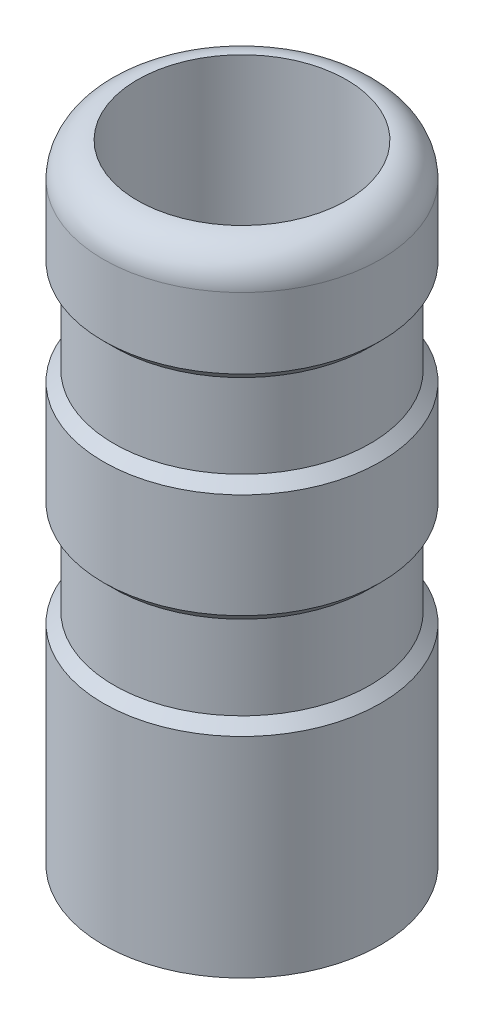
ISO-10303-21;
HEADER;
FILE_DESCRIPTION(('STEP AP214'),'2;1');
FILE_NAME('part.step','',(''),(''),'','','');
FILE_SCHEMA(('AUTOMOTIVE_DESIGN { 1 0 10303 214 1 1 1 1 }'));
ENDSEC;
DATA;
#1=APPLICATION_CONTEXT('core data for automotive mechanical design processes');
#2=APPLICATION_PROTOCOL_DEFINITION('international standard','automotive_design',2000,#1);
#3=PRODUCT_CONTEXT('',#1,'mechanical');
#4=PRODUCT('Part','Part','',(#3));
#5=PRODUCT_RELATED_PRODUCT_CATEGORY('part','',(#4));
#6=PRODUCT_DEFINITION_FORMATION('','',#4);
#7=PRODUCT_DEFINITION_CONTEXT('part definition',#1,'design');
#8=PRODUCT_DEFINITION('design','',#6,#7);
#9=PRODUCT_DEFINITION_SHAPE('','',#8);
#10=(LENGTH_UNIT() NAMED_UNIT(*) SI_UNIT(.MILLI.,.METRE.));
#11=(NAMED_UNIT(*) PLANE_ANGLE_UNIT() SI_UNIT($,.RADIAN.));
#12=(NAMED_UNIT(*) SI_UNIT($,.STERADIAN.) SOLID_ANGLE_UNIT());
#13=UNCERTAINTY_MEASURE_WITH_UNIT(LENGTH_MEASURE(1.E-05),#10,'distance_accuracy_value','');
#14=(GEOMETRIC_REPRESENTATION_CONTEXT(3) GLOBAL_UNCERTAINTY_ASSIGNED_CONTEXT((#13)) GLOBAL_UNIT_ASSIGNED_CONTEXT((#10,
#11,#12)) REPRESENTATION_CONTEXT('',''));
#15=CARTESIAN_POINT('',(0.,0.,0.));
#16=DIRECTION('',(0.,0.,1.));
#17=DIRECTION('',(1.,0.,0.));
#18=AXIS2_PLACEMENT_3D('',#15,#16,#17);
#19=CARTESIAN_POINT('',(0.,76.2,0.));
#20=DIRECTION('',(0.,-1.,0.));
#21=DIRECTION('',(0.,0.,-1.));
#22=AXIS2_PLACEMENT_3D('',#19,#20,#21);
#23=CYLINDRICAL_SURFACE('',#22,16.8275);
#24=CARTESIAN_POINT('',(0.,38.1,0.));
#25=DIRECTION('',(0.,-1.,0.));
#26=DIRECTION('',(0.,0.,-1.));
#27=AXIS2_PLACEMENT_3D('',#24,#25,#26);
#28=CIRCLE('',#27,16.8275);
#29=CARTESIAN_POINT('',(0.,38.1,-16.8275));
#30=VERTEX_POINT('',#29);
#31=EDGE_CURVE('E77',#30,#30,#28,.T.);
#32=CARTESIAN_POINT('',(0.,50.8,0.));
#33=DIRECTION('',(0.,-1.,0.));
#34=DIRECTION('',(0.,0.,-1.));
#35=AXIS2_PLACEMENT_3D('',#32,#33,#34);
#36=CIRCLE('',#35,16.8275);
#37=CARTESIAN_POINT('',(0.,50.8,-16.8275));
#38=VERTEX_POINT('',#37);
#39=EDGE_CURVE('E73',#38,#38,#36,.T.);
#40=CARTESIAN_POINT('',(0.,38.1,-16.8275));
#41=CARTESIAN_POINT('',(0.,38.2322916666667,-16.8275));
#42=CARTESIAN_POINT('',(0.,38.3645833333333,-16.8275));
#43=CARTESIAN_POINT('',(0.,38.6291666666667,-16.8275));
#44=CARTESIAN_POINT('',(0.,38.7614583333333,-16.8275));
#45=CARTESIAN_POINT('',(0.,39.0260416666667,-16.8275));
#46=CARTESIAN_POINT('',(0.,39.1583333333334,-16.8275));
#47=CARTESIAN_POINT('',(0.,39.4229166666667,-16.8275));
#48=CARTESIAN_POINT('',(0.,39.5552083333333,-16.8275));
#49=CARTESIAN_POINT('',(0.,39.8197916666667,-16.8275));
#50=CARTESIAN_POINT('',(0.,39.9520833333333,-16.8275));
#51=CARTESIAN_POINT('',(0.,40.2166666666667,-16.8275));
#52=CARTESIAN_POINT('',(0.,40.3489583333333,-16.8275));
#53=CARTESIAN_POINT('',(0.,40.6135416666667,-16.8275));
#54=CARTESIAN_POINT('',(0.,40.7458333333334,-16.8275));
#55=CARTESIAN_POINT('',(0.,41.0104166666667,-16.8275));
#56=CARTESIAN_POINT('',(0.,41.1427083333333,-16.8275));
#57=CARTESIAN_POINT('',(0.,41.4072916666667,-16.8275));
#58=CARTESIAN_POINT('',(0.,41.5395833333333,-16.8275));
#59=CARTESIAN_POINT('',(0.,41.8041666666667,-16.8275));
#60=CARTESIAN_POINT('',(0.,41.9364583333333,-16.8275));
#61=CARTESIAN_POINT('',(0.,42.2010416666667,-16.8275));
#62=CARTESIAN_POINT('',(0.,42.3333333333333,-16.8275));
#63=CARTESIAN_POINT('',(0.,42.5979166666667,-16.8275));
#64=CARTESIAN_POINT('',(0.,42.7302083333333,-16.8275));
#65=CARTESIAN_POINT('',(0.,42.9947916666667,-16.8275));
#66=CARTESIAN_POINT('',(0.,43.1270833333333,-16.8275));
#67=CARTESIAN_POINT('',(0.,43.3916666666667,-16.8275));
#68=CARTESIAN_POINT('',(0.,43.5239583333333,-16.8275));
#69=CARTESIAN_POINT('',(0.,43.7885416666667,-16.8275));
#70=CARTESIAN_POINT('',(0.,43.9208333333333,-16.8275));
#71=CARTESIAN_POINT('',(0.,44.1854166666667,-16.8275));
#72=CARTESIAN_POINT('',(0.,44.3177083333333,-16.8275));
#73=CARTESIAN_POINT('',(0.,44.5822916666667,-16.8275));
#74=CARTESIAN_POINT('',(0.,44.7145833333333,-16.8275));
#75=CARTESIAN_POINT('',(0.,44.9791666666667,-16.8275));
#76=CARTESIAN_POINT('',(0.,45.1114583333333,-16.8275));
#77=CARTESIAN_POINT('',(0.,45.3760416666667,-16.8275));
#78=CARTESIAN_POINT('',(0.,45.5083333333333,-16.8275));
#79=CARTESIAN_POINT('',(0.,45.7729166666667,-16.8275));
#80=CARTESIAN_POINT('',(0.,45.9052083333333,-16.8275));
#81=CARTESIAN_POINT('',(0.,46.1697916666667,-16.8275));
#82=CARTESIAN_POINT('',(0.,46.3020833333333,-16.8275));
#83=CARTESIAN_POINT('',(0.,46.5666666666667,-16.8275));
#84=CARTESIAN_POINT('',(0.,46.6989583333333,-16.8275));
#85=CARTESIAN_POINT('',(0.,46.9635416666667,-16.8275));
#86=CARTESIAN_POINT('',(0.,47.0958333333333,-16.8275));
#87=CARTESIAN_POINT('',(0.,47.3604166666667,-16.8275));
#88=CARTESIAN_POINT('',(0.,47.4927083333333,-16.8275));
#89=CARTESIAN_POINT('',(0.,47.7572916666667,-16.8275));
#90=CARTESIAN_POINT('',(0.,47.8895833333333,-16.8275));
#91=CARTESIAN_POINT('',(0.,48.1541666666667,-16.8275));
#92=CARTESIAN_POINT('',(0.,48.2864583333333,-16.8275));
#93=CARTESIAN_POINT('',(0.,48.5510416666667,-16.8275));
#94=CARTESIAN_POINT('',(0.,48.6833333333333,-16.8275));
#95=CARTESIAN_POINT('',(0.,48.9479166666667,-16.8275));
#96=CARTESIAN_POINT('',(0.,49.0802083333333,-16.8275));
#97=CARTESIAN_POINT('',(0.,49.3447916666667,-16.8275));
#98=CARTESIAN_POINT('',(0.,49.4770833333333,-16.8275));
#99=CARTESIAN_POINT('',(0.,49.7416666666667,-16.8275));
#100=CARTESIAN_POINT('',(0.,49.8739583333333,-16.8275));
#101=CARTESIAN_POINT('',(0.,50.1385416666667,-16.8275));
#102=CARTESIAN_POINT('',(0.,50.2708333333333,-16.8275));
#103=CARTESIAN_POINT('',(0.,50.5354166666667,-16.8275));
#104=CARTESIAN_POINT('',(0.,50.6677083333333,-16.8275));
#105=CARTESIAN_POINT('',(0.,50.8,-16.8275));
#106=B_SPLINE_CURVE_WITH_KNOTS('',3,(#40,#41,#42,#43,#44,#45,#46,#47,#48,#49,#50,#51,#52,#53,
#54,#55,#56,#57,#58,#59,#60,#61,#62,#63,#64,#65,#66,#67,#68,#69,#70,#71,#72,#73,#74,#75,#76,#77,
#78,#79,#80,#81,#82,#83,#84,#85,#86,#87,#88,#89,#90,#91,#92,#93,#94,#95,#96,#97,#98,#99,#100,
#101,#102,#103,#104,#105),.UNSPECIFIED.,.F.,.F.,(4,2,2,2,2,2,2,2,2,2,2,2,2,2,2,2,2,2,2,2,2,2,2,
2,2,2,2,2,2,2,2,2,4),(0.,0.396874999999998,0.793749999999996,1.190625,1.5875,1.984375,2.38125,
2.778125,3.175,3.571875,3.96874999999999,4.365625,4.7625,5.15937499999999,5.55625,5.953125,
6.34999999999999,6.74687499999999,7.14374999999999,7.54062499999999,7.93749999999999,
8.33437499999998,8.73124999999999,9.12812499999999,9.52499999999998,9.92187499999999,10.31875,
10.715625,11.1125,11.509375,11.90625,12.303125,12.7),.UNSPECIFIED.);
#107=EDGE_CURVE('BSEAM37',#30,#38,#106,.T.);
#108=ORIENTED_EDGE('',*,*,#31,.F.);
#109=ORIENTED_EDGE('',*,*,#39,.T.);
#110=ORIENTED_EDGE('',*,*,#107,.T.);
#111=ORIENTED_EDGE('',*,*,#107,.F.);
#112=EDGE_LOOP('',(#108,#110,#109,#111));
#113=FACE_BOUND('',#112,.T.);
#114=ADVANCED_FACE('F37',(#113),#23,.T.);
#115=CARTESIAN_POINT('',(0.,63.5,0.));
#116=DIRECTION('',(0.,-1.,0.));
#117=DIRECTION('',(0.,0.,-1.));
#118=AXIS2_PLACEMENT_3D('',#115,#116,#117);
#119=CIRCLE('',#118,16.8275);
#120=CARTESIAN_POINT('',(0.,63.5,-16.8275));
#121=VERTEX_POINT('',#120);
#122=EDGE_CURVE('E60',#121,#121,#119,.T.);
#123=CARTESIAN_POINT('',(0.,72.0725,0.));
#124=DIRECTION('',(0.,1.,0.));
#125=DIRECTION('',(0.,0.,1.));
#126=AXIS2_PLACEMENT_3D('',#123,#124,#125);
#127=CIRCLE('',#126,16.8275);
#128=CARTESIAN_POINT('',(0.,72.0725,-16.8275));
#129=VERTEX_POINT('',#128);
#130=EDGE_CURVE('E10',#129,#129,#127,.F.);
#131=CARTESIAN_POINT('',(0.,63.5,-16.8275));
#132=CARTESIAN_POINT('',(0.,63.589296875,-16.8275));
#133=CARTESIAN_POINT('',(0.,63.67859375,-16.8275));
#134=CARTESIAN_POINT('',(0.,63.8571875,-16.8275));
#135=CARTESIAN_POINT('',(0.,63.946484375,-16.8275));
#136=CARTESIAN_POINT('',(0.,64.125078125,-16.8275));
#137=CARTESIAN_POINT('',(0.,64.214375,-16.8275));
#138=CARTESIAN_POINT('',(0.,64.39296875,-16.8275));
#139=CARTESIAN_POINT('',(0.,64.482265625,-16.8275));
#140=CARTESIAN_POINT('',(0.,64.660859375,-16.8275));
#141=CARTESIAN_POINT('',(0.,64.75015625,-16.8275));
#142=CARTESIAN_POINT('',(0.,64.92875,-16.8275));
#143=CARTESIAN_POINT('',(0.,65.018046875,-16.8275));
#144=CARTESIAN_POINT('',(0.,65.196640625,-16.8275));
#145=CARTESIAN_POINT('',(0.,65.2859375,-16.8275));
#146=CARTESIAN_POINT('',(0.,65.46453125,-16.8275));
#147=CARTESIAN_POINT('',(0.,65.553828125,-16.8275));
#148=CARTESIAN_POINT('',(0.,65.732421875,-16.8275));
#149=CARTESIAN_POINT('',(0.,65.82171875,-16.8275));
#150=CARTESIAN_POINT('',(0.,66.0003125,-16.8275));
#151=CARTESIAN_POINT('',(0.,66.089609375,-16.8275));
#152=CARTESIAN_POINT('',(0.,66.268203125,-16.8275));
#153=CARTESIAN_POINT('',(0.,66.3575,-16.8275));
#154=CARTESIAN_POINT('',(0.,66.53609375,-16.8275));
#155=CARTESIAN_POINT('',(0.,66.625390625,-16.8275));
#156=CARTESIAN_POINT('',(0.,66.803984375,-16.8275));
#157=CARTESIAN_POINT('',(0.,66.89328125,-16.8275));
#158=CARTESIAN_POINT('',(0.,67.071875,-16.8275));
#159=CARTESIAN_POINT('',(0.,67.161171875,-16.8275));
#160=CARTESIAN_POINT('',(0.,67.339765625,-16.8275));
#161=CARTESIAN_POINT('',(0.,67.4290625,-16.8275));
#162=CARTESIAN_POINT('',(0.,67.60765625,-16.8275));
#163=CARTESIAN_POINT('',(0.,67.696953125,-16.8275));
#164=CARTESIAN_POINT('',(0.,67.875546875,-16.8275));
#165=CARTESIAN_POINT('',(0.,67.96484375,-16.8275));
#166=CARTESIAN_POINT('',(0.,68.1434375,-16.8275));
#167=CARTESIAN_POINT('',(0.,68.232734375,-16.8275));
#168=CARTESIAN_POINT('',(0.,68.411328125,-16.8275));
#169=CARTESIAN_POINT('',(0.,68.500625,-16.8275));
#170=CARTESIAN_POINT('',(0.,68.67921875,-16.8275));
#171=CARTESIAN_POINT('',(0.,68.768515625,-16.8275));
#172=CARTESIAN_POINT('',(0.,68.947109375,-16.8275));
#173=CARTESIAN_POINT('',(0.,69.03640625,-16.8275));
#174=CARTESIAN_POINT('',(0.,69.215,-16.8275));
#175=CARTESIAN_POINT('',(0.,69.304296875,-16.8275));
#176=CARTESIAN_POINT('',(0.,69.482890625,-16.8275));
#177=CARTESIAN_POINT('',(0.,69.5721875,-16.8275));
#178=CARTESIAN_POINT('',(0.,69.75078125,-16.8275));
#179=CARTESIAN_POINT('',(0.,69.840078125,-16.8275));
#180=CARTESIAN_POINT('',(0.,70.018671875,-16.8275));
#181=CARTESIAN_POINT('',(0.,70.10796875,-16.8275));
#182=CARTESIAN_POINT('',(0.,70.2865625,-16.8275));
#183=CARTESIAN_POINT('',(0.,70.375859375,-16.8275));
#184=CARTESIAN_POINT('',(0.,70.554453125,-16.8275));
#185=CARTESIAN_POINT('',(0.,70.64375,-16.8275));
#186=CARTESIAN_POINT('',(0.,70.82234375,-16.8275));
#187=CARTESIAN_POINT('',(0.,70.911640625,-16.8275));
#188=CARTESIAN_POINT('',(0.,71.090234375,-16.8275));
#189=CARTESIAN_POINT('',(0.,71.17953125,-16.8275));
#190=CARTESIAN_POINT('',(0.,71.358125,-16.8275));
#191=CARTESIAN_POINT('',(0.,71.447421875,-16.8275));
#192=CARTESIAN_POINT('',(0.,71.626015625,-16.8275));
#193=CARTESIAN_POINT('',(0.,71.7153125,-16.8275));
#194=CARTESIAN_POINT('',(0.,71.89390625,-16.8275));
#195=CARTESIAN_POINT('',(0.,71.983203125,-16.8275));
#196=CARTESIAN_POINT('',(0.,72.0725,-16.8275));
#197=B_SPLINE_CURVE_WITH_KNOTS('',3,(#131,#132,#133,#134,#135,#136,#137,#138,#139,#140,#141,
#142,#143,#144,#145,#146,#147,#148,#149,#150,#151,#152,#153,#154,#155,#156,#157,#158,#159,#160,
#161,#162,#163,#164,#165,#166,#167,#168,#169,#170,#171,#172,#173,#174,#175,#176,#177,#178,#179,
#180,#181,#182,#183,#184,#185,#186,#187,#188,#189,#190,#191,#192,#193,#194,#195,#196),
.UNSPECIFIED.,.F.,.F.,(4,2,2,2,2,2,2,2,2,2,2,2,2,2,2,2,2,2,2,2,2,2,2,2,2,2,2,2,2,2,2,2,4),(0.,
0.267890624999989,0.535781249999992,0.803671874999995,1.0715625,1.33945312499999,
1.60734374999999,1.87523437499999,2.143125,2.41101562499999,2.67890624999999,2.94679687499999,
3.21468749999999,3.48257812499998,3.75046874999999,4.01835937499999,4.28624999999999,
4.55414062499998,4.82203124999998,5.08992187499999,5.35781249999999,5.62570312499998,
5.89359374999998,6.16148437499998,6.42937499999999,6.69726562499998,6.96515624999998,
7.23304687499998,7.50093749999998,7.76882812499997,8.03671874999998,8.30460937499998,
8.57249999999998),.UNSPECIFIED.);
#198=EDGE_CURVE('BSEAM117',#121,#129,#197,.T.);
#199=ORIENTED_EDGE('',*,*,#122,.F.);
#200=ORIENTED_EDGE('',*,*,#130,.T.);
#201=ORIENTED_EDGE('',*,*,#198,.T.);
#202=ORIENTED_EDGE('',*,*,#198,.F.);
#203=EDGE_LOOP('',(#199,#201,#200,#202));
#204=FACE_BOUND('',#203,.T.);
#205=ADVANCED_FACE('F117',(#204),#23,.T.);
#206=CARTESIAN_POINT('',(0.,0.,0.));
#207=DIRECTION('',(0.,1.,0.));
#208=DIRECTION('',(0.,0.,1.));
#209=AXIS2_PLACEMENT_3D('',#206,#207,#208);
#210=PLANE('',#209);
#211=CARTESIAN_POINT('',(0.,0.,0.));
#212=DIRECTION('',(0.,1.,0.));
#213=DIRECTION('',(0.,0.,1.));
#214=AXIS2_PLACEMENT_3D('',#211,#212,#213);
#215=CIRCLE('',#214,16.8275);
#216=CARTESIAN_POINT('',(0.,0.,-16.8275));
#217=VERTEX_POINT('',#216);
#218=EDGE_CURVE('E45',#217,#217,#215,.T.);
#219=ORIENTED_EDGE('',*,*,#218,.F.);
#220=EDGE_LOOP('',(#219));
#221=FACE_BOUND('',#220,.T.);
#222=CARTESIAN_POINT('',(0.,0.,0.));
#223=DIRECTION('',(0.,1.,0.));
#224=DIRECTION('',(0.,0.,1.));
#225=AXIS2_PLACEMENT_3D('',#222,#223,#224);
#226=CIRCLE('',#225,12.7);
#227=CARTESIAN_POINT('',(0.,0.,-12.7));
#228=VERTEX_POINT('',#227);
#229=EDGE_CURVE('E55',#228,#228,#226,.T.);
#230=ORIENTED_EDGE('',*,*,#229,.T.);
#231=EDGE_LOOP('',(#230));
#232=FACE_BOUND('',#231,.T.);
#233=ADVANCED_FACE('F138',(#221,#232),#210,.F.);
#234=CARTESIAN_POINT('',(0.,25.4,0.));
#235=DIRECTION('',(0.,-1.,0.));
#236=DIRECTION('',(0.,0.,-1.));
#237=AXIS2_PLACEMENT_3D('',#234,#235,#236);
#238=CIRCLE('',#237,16.8275);
#239=CARTESIAN_POINT('',(0.,25.4,-16.8275));
#240=VERTEX_POINT('',#239);
#241=EDGE_CURVE('E89',#240,#240,#238,.T.);
#242=CARTESIAN_POINT('',(0.,25.4,-16.8275));
#243=CARTESIAN_POINT('',(0.,25.1354166666667,-16.8275));
#244=CARTESIAN_POINT('',(0.,24.8708333333333,-16.8275));
#245=CARTESIAN_POINT('',(0.,24.3416666666667,-16.8275));
#246=CARTESIAN_POINT('',(0.,24.0770833333333,-16.8275));
#247=CARTESIAN_POINT('',(0.,23.5479166666667,-16.8275));
#248=CARTESIAN_POINT('',(0.,23.2833333333333,-16.8275));
#249=CARTESIAN_POINT('',(0.,22.7541666666667,-16.8275));
#250=CARTESIAN_POINT('',(0.,22.4895833333333,-16.8275));
#251=CARTESIAN_POINT('',(0.,21.9604166666667,-16.8275));
#252=CARTESIAN_POINT('',(0.,21.6958333333333,-16.8275));
#253=CARTESIAN_POINT('',(0.,21.1666666666667,-16.8275));
#254=CARTESIAN_POINT('',(0.,20.9020833333333,-16.8275));
#255=CARTESIAN_POINT('',(0.,20.3729166666667,-16.8275));
#256=CARTESIAN_POINT('',(0.,20.1083333333333,-16.8275));
#257=CARTESIAN_POINT('',(0.,19.5791666666667,-16.8275));
#258=CARTESIAN_POINT('',(0.,19.3145833333333,-16.8275));
#259=CARTESIAN_POINT('',(0.,18.7854166666667,-16.8275));
#260=CARTESIAN_POINT('',(0.,18.5208333333333,-16.8275));
#261=CARTESIAN_POINT('',(0.,17.9916666666667,-16.8275));
#262=CARTESIAN_POINT('',(0.,17.7270833333333,-16.8275));
#263=CARTESIAN_POINT('',(0.,17.1979166666667,-16.8275));
#264=CARTESIAN_POINT('',(0.,16.9333333333333,-16.8275));
#265=CARTESIAN_POINT('',(0.,16.4041666666667,-16.8275));
#266=CARTESIAN_POINT('',(0.,16.1395833333333,-16.8275));
#267=CARTESIAN_POINT('',(0.,15.6104166666667,-16.8275));
#268=CARTESIAN_POINT('',(0.,15.3458333333333,-16.8275));
#269=CARTESIAN_POINT('',(0.,14.8166666666667,-16.8275));
#270=CARTESIAN_POINT('',(0.,14.5520833333333,-16.8275));
#271=CARTESIAN_POINT('',(0.,14.0229166666667,-16.8275));
#272=CARTESIAN_POINT('',(0.,13.7583333333333,-16.8275));
#273=CARTESIAN_POINT('',(0.,13.2291666666667,-16.8275));
#274=CARTESIAN_POINT('',(0.,12.9645833333333,-16.8275));
#275=CARTESIAN_POINT('',(0.,12.4354166666667,-16.8275));
#276=CARTESIAN_POINT('',(0.,12.1708333333333,-16.8275));
#277=CARTESIAN_POINT('',(0.,11.6416666666667,-16.8275));
#278=CARTESIAN_POINT('',(0.,11.3770833333333,-16.8275));
#279=CARTESIAN_POINT('',(0.,10.8479166666667,-16.8275));
#280=CARTESIAN_POINT('',(0.,10.5833333333333,-16.8275));
#281=CARTESIAN_POINT('',(0.,10.0541666666667,-16.8275));
#282=CARTESIAN_POINT('',(0.,9.78958333333334,-16.8275));
#283=CARTESIAN_POINT('',(0.,9.26041666666667,-16.8275));
#284=CARTESIAN_POINT('',(0.,8.99583333333334,-16.8275));
#285=CARTESIAN_POINT('',(0.,8.46666666666668,-16.8275));
#286=CARTESIAN_POINT('',(0.,8.20208333333335,-16.8275));
#287=CARTESIAN_POINT('',(0.,7.67291666666668,-16.8275));
#288=CARTESIAN_POINT('',(0.,7.40833333333334,-16.8275));
#289=CARTESIAN_POINT('',(0.,6.87916666666667,-16.8275));
#290=CARTESIAN_POINT('',(0.,6.61458333333334,-16.8275));
#291=CARTESIAN_POINT('',(0.,6.08541666666668,-16.8275));
#292=CARTESIAN_POINT('',(0.,5.82083333333334,-16.8275));
#293=CARTESIAN_POINT('',(0.,5.29166666666668,-16.8275));
#294=CARTESIAN_POINT('',(0.,5.02708333333334,-16.8275));
#295=CARTESIAN_POINT('',(0.,4.49791666666667,-16.8275));
#296=CARTESIAN_POINT('',(0.,4.23333333333334,-16.8275));
#297=CARTESIAN_POINT('',(0.,3.70416666666668,-16.8275));
#298=CARTESIAN_POINT('',(0.,3.43958333333334,-16.8275));
#299=CARTESIAN_POINT('',(0.,2.91041666666667,-16.8275));
#300=CARTESIAN_POINT('',(0.,2.64583333333334,-16.8275));
#301=CARTESIAN_POINT('',(0.,2.11666666666667,-16.8275));
#302=CARTESIAN_POINT('',(0.,1.85208333333334,-16.8275));
#303=CARTESIAN_POINT('',(0.,1.32291666666667,-16.8275));
#304=CARTESIAN_POINT('',(0.,1.05833333333333,-16.8275));
#305=CARTESIAN_POINT('',(0.,0.529166666666664,-16.8275));
#306=CARTESIAN_POINT('',(0.,0.264583333333332,-16.8275));
#307=CARTESIAN_POINT('',(0.,0.,-16.8275));
#308=B_SPLINE_CURVE_WITH_KNOTS('',3,(#242,#243,#244,#245,#246,#247,#248,#249,#250,#251,#252,
#253,#254,#255,#256,#257,#258,#259,#260,#261,#262,#263,#264,#265,#266,#267,#268,#269,#270,#271,
#272,#273,#274,#275,#276,#277,#278,#279,#280,#281,#282,#283,#284,#285,#286,#287,#288,#289,#290,
#291,#292,#293,#294,#295,#296,#297,#298,#299,#300,#301,#302,#303,#304,#305,#306,#307),
.UNSPECIFIED.,.F.,.F.,(4,2,2,2,2,2,2,2,2,2,2,2,2,2,2,2,2,2,2,2,2,2,2,2,2,2,2,2,2,2,2,2,4),(0.,
0.793750000000003,1.5875,2.38125,3.175,3.96875000000001,4.7625,5.55625000000001,
6.35000000000001,7.14375,7.93750000000001,8.73125000000001,9.52500000000001,10.31875,11.1125,
11.90625,12.7,13.49375,14.2875,15.08125,15.875,16.66875,17.4625,18.25625,19.05,19.84375,20.6375,
21.43125,22.225,23.01875,23.8125,24.60625,25.4),.UNSPECIFIED.);
#309=EDGE_CURVE('BSEAM94',#240,#217,#308,.T.);
#310=ORIENTED_EDGE('',*,*,#241,.T.);
#311=ORIENTED_EDGE('',*,*,#218,.T.);
#312=ORIENTED_EDGE('',*,*,#309,.T.);
#313=ORIENTED_EDGE('',*,*,#309,.F.);
#314=EDGE_LOOP('',(#310,#312,#311,#313));
#315=FACE_BOUND('',#314,.T.);
#316=ADVANCED_FACE('F94',(#315),#23,.T.);
#317=CARTESIAN_POINT('',(0.,76.2,0.));
#318=DIRECTION('',(0.,-1.,0.));
#319=DIRECTION('',(0.,0.,-1.));
#320=AXIS2_PLACEMENT_3D('',#317,#318,#319);
#321=CYLINDRICAL_SURFACE('',#320,12.7);
#322=CARTESIAN_POINT('',(0.,76.2,0.));
#323=DIRECTION('',(0.,1.,0.));
#324=DIRECTION('',(0.,0.,1.));
#325=AXIS2_PLACEMENT_3D('',#322,#323,#324);
#326=CIRCLE('',#325,12.7);
#327=CARTESIAN_POINT('',(0.,76.2,-12.7));
#328=VERTEX_POINT('',#327);
#329=EDGE_CURVE('E50',#328,#328,#326,.T.);
#330=CARTESIAN_POINT('',(0.,76.2,-12.7));
#331=CARTESIAN_POINT('',(0.,75.40625,-12.7));
#332=CARTESIAN_POINT('',(0.,74.6125,-12.7));
#333=CARTESIAN_POINT('',(0.,73.025,-12.7));
#334=CARTESIAN_POINT('',(0.,72.23125,-12.7));
#335=CARTESIAN_POINT('',(0.,70.64375,-12.7));
#336=CARTESIAN_POINT('',(0.,69.85,-12.7));
#337=CARTESIAN_POINT('',(0.,68.2625,-12.7));
#338=CARTESIAN_POINT('',(0.,67.46875,-12.7));
#339=CARTESIAN_POINT('',(0.,65.88125,-12.7));
#340=CARTESIAN_POINT('',(0.,65.0875,-12.7));
#341=CARTESIAN_POINT('',(0.,63.5,-12.7));
#342=CARTESIAN_POINT('',(0.,62.70625,-12.7));
#343=CARTESIAN_POINT('',(0.,61.11875,-12.7));
#344=CARTESIAN_POINT('',(0.,60.325,-12.7));
#345=CARTESIAN_POINT('',(0.,58.7375,-12.7));
#346=CARTESIAN_POINT('',(0.,57.94375,-12.7));
#347=CARTESIAN_POINT('',(0.,56.35625,-12.7));
#348=CARTESIAN_POINT('',(0.,55.5625,-12.7));
#349=CARTESIAN_POINT('',(0.,53.975,-12.7));
#350=CARTESIAN_POINT('',(0.,53.18125,-12.7));
#351=CARTESIAN_POINT('',(0.,51.59375,-12.7));
#352=CARTESIAN_POINT('',(0.,50.8,-12.7));
#353=CARTESIAN_POINT('',(0.,49.2125,-12.7));
#354=CARTESIAN_POINT('',(0.,48.41875,-12.7));
#355=CARTESIAN_POINT('',(0.,46.83125,-12.7));
#356=CARTESIAN_POINT('',(0.,46.0375,-12.7));
#357=CARTESIAN_POINT('',(0.,44.45,-12.7));
#358=CARTESIAN_POINT('',(0.,43.65625,-12.7));
#359=CARTESIAN_POINT('',(0.,42.06875,-12.7));
#360=CARTESIAN_POINT('',(0.,41.275,-12.7));
#361=CARTESIAN_POINT('',(0.,39.6875,-12.7));
#362=CARTESIAN_POINT('',(0.,38.89375,-12.7));
#363=CARTESIAN_POINT('',(0.,37.30625,-12.7));
#364=CARTESIAN_POINT('',(0.,36.5125,-12.7));
#365=CARTESIAN_POINT('',(0.,34.925,-12.7));
#366=CARTESIAN_POINT('',(0.,34.13125,-12.7));
#367=CARTESIAN_POINT('',(0.,32.54375,-12.7));
#368=CARTESIAN_POINT('',(0.,31.75,-12.7));
#369=CARTESIAN_POINT('',(0.,30.1625,-12.7));
#370=CARTESIAN_POINT('',(0.,29.36875,-12.7));
#371=CARTESIAN_POINT('',(0.,27.78125,-12.7));
#372=CARTESIAN_POINT('',(0.,26.9875,-12.7));
#373=CARTESIAN_POINT('',(0.,25.4,-12.7));
#374=CARTESIAN_POINT('',(0.,24.60625,-12.7));
#375=CARTESIAN_POINT('',(0.,23.01875,-12.7));
#376=CARTESIAN_POINT('',(0.,22.225,-12.7));
#377=CARTESIAN_POINT('',(0.,20.6375,-12.7));
#378=CARTESIAN_POINT('',(0.,19.84375,-12.7));
#379=CARTESIAN_POINT('',(0.,18.25625,-12.7));
#380=CARTESIAN_POINT('',(0.,17.4625,-12.7));
#381=CARTESIAN_POINT('',(0.,15.875,-12.7));
#382=CARTESIAN_POINT('',(0.,15.08125,-12.7));
#383=CARTESIAN_POINT('',(0.,13.49375,-12.7));
#384=CARTESIAN_POINT('',(0.,12.7,-12.7));
#385=CARTESIAN_POINT('',(0.,11.1125,-12.7));
#386=CARTESIAN_POINT('',(0.,10.31875,-12.7));
#387=CARTESIAN_POINT('',(0.,8.73125,-12.7));
#388=CARTESIAN_POINT('',(0.,7.93750000000001,-12.7));
#389=CARTESIAN_POINT('',(0.,6.35,-12.7));
#390=CARTESIAN_POINT('',(0.,5.55625,-12.7));
#391=CARTESIAN_POINT('',(0.,3.96875,-12.7));
#392=CARTESIAN_POINT('',(0.,3.175,-12.7));
#393=CARTESIAN_POINT('',(0.,1.5875,-12.7));
#394=CARTESIAN_POINT('',(0.,0.793750000000001,-12.7));
#395=CARTESIAN_POINT('',(0.,0.,-12.7));
#396=B_SPLINE_CURVE_WITH_KNOTS('',3,(#330,#331,#332,#333,#334,#335,#336,#337,#338,#339,#340,
#341,#342,#343,#344,#345,#346,#347,#348,#349,#350,#351,#352,#353,#354,#355,#356,#357,#358,#359,
#360,#361,#362,#363,#364,#365,#366,#367,#368,#369,#370,#371,#372,#373,#374,#375,#376,#377,#378,
#379,#380,#381,#382,#383,#384,#385,#386,#387,#388,#389,#390,#391,#392,#393,#394,#395),
.UNSPECIFIED.,.F.,.F.,(4,2,2,2,2,2,2,2,2,2,2,2,2,2,2,2,2,2,2,2,2,2,2,2,2,2,2,2,2,2,2,2,4),(0.,
2.38124999999999,4.76249999999999,7.14374999999999,9.52499999999999,11.90625,14.2875,16.66875,
19.05,21.43125,23.8125,26.19375,28.575,30.95625,33.3375,35.71875,38.1,40.48125,42.8625,45.24375,
47.625,50.00625,52.3875,54.76875,57.15,59.53125,61.9125,64.29375,66.675,69.05625,71.4375,
73.81875,76.2),.UNSPECIFIED.);
#397=EDGE_CURVE('BSEAM145',#328,#228,#396,.T.);
#398=ORIENTED_EDGE('',*,*,#329,.T.);
#399=ORIENTED_EDGE('',*,*,#229,.F.);
#400=ORIENTED_EDGE('',*,*,#397,.T.);
#401=ORIENTED_EDGE('',*,*,#397,.F.);
#402=EDGE_LOOP('',(#398,#400,#399,#401));
#403=FACE_BOUND('',#402,.T.);
#404=ADVANCED_FACE('F145',(#403),#321,.F.);
#405=CARTESIAN_POINT('',(0.,72.0725,0.));
#406=DIRECTION('',(0.,1.,0.));
#407=DIRECTION('',(0.,0.,1.));
#408=AXIS2_PLACEMENT_3D('',#405,#406,#407);
#409=TOROIDAL_SURFACE('',#408,12.7,4.1275);
#410=ORIENTED_EDGE('',*,*,#130,.F.);
#411=EDGE_LOOP('',(#410));
#412=FACE_BOUND('',#411,.T.);
#413=ORIENTED_EDGE('',*,*,#329,.F.);
#414=EDGE_LOOP('',(#413));
#415=FACE_BOUND('',#414,.T.);
#416=ADVANCED_FACE('F39',(#412,#415),#409,.T.);
#417=CARTESIAN_POINT('',(0.,63.5,0.));
#418=DIRECTION('',(0.,1.,0.));
#419=DIRECTION('',(0.,0.,1.));
#420=AXIS2_PLACEMENT_3D('',#417,#418,#419);
#421=CONICAL_SURFACE('',#420,16.8275,0.785398163397446);
#422=CARTESIAN_POINT('',(0.,62.23,0.));
#423=DIRECTION('',(0.,-1.,0.));
#424=DIRECTION('',(0.,0.,-1.));
#425=AXIS2_PLACEMENT_3D('',#422,#423,#424);
#426=CIRCLE('',#425,15.5575);
#427=CARTESIAN_POINT('',(0.,62.23,-15.5575));
#428=VERTEX_POINT('',#427);
#429=EDGE_CURVE('E65',#428,#428,#426,.T.);
#430=ORIENTED_EDGE('',*,*,#429,.F.);
#431=EDGE_LOOP('',(#430));
#432=FACE_BOUND('',#431,.T.);
#433=ORIENTED_EDGE('',*,*,#122,.T.);
#434=EDGE_LOOP('',(#433));
#435=FACE_BOUND('',#434,.T.);
#436=ADVANCED_FACE('F128',(#432,#435),#421,.T.);
#437=CARTESIAN_POINT('',(0.,0.,0.));
#438=DIRECTION('',(0.,-1.,0.));
#439=DIRECTION('',(0.,0.,-1.));
#440=AXIS2_PLACEMENT_3D('',#437,#438,#439);
#441=CYLINDRICAL_SURFACE('',#440,15.5575);
#442=CARTESIAN_POINT('',(0.,52.07,0.));
#443=DIRECTION('',(0.,-1.,0.));
#444=DIRECTION('',(0.,0.,-1.));
#445=AXIS2_PLACEMENT_3D('',#442,#443,#444);
#446=CIRCLE('',#445,15.5575);
#447=CARTESIAN_POINT('',(0.,52.07,-15.5575));
#448=VERTEX_POINT('',#447);
#449=EDGE_CURVE('E69',#448,#448,#446,.T.);
#450=ORIENTED_EDGE('',*,*,#449,.F.);
#451=EDGE_LOOP('',(#450));
#452=FACE_BOUND('',#451,.T.);
#453=ORIENTED_EDGE('',*,*,#429,.T.);
#454=EDGE_LOOP('',(#453));
#455=FACE_BOUND('',#454,.T.);
#456=ADVANCED_FACE('F122',(#452,#455),#441,.T.);
#457=CARTESIAN_POINT('',(0.,52.07,0.));
#458=DIRECTION('',(0.,-1.,0.));
#459=DIRECTION('',(0.,0.,-1.));
#460=AXIS2_PLACEMENT_3D('',#457,#458,#459);
#461=CONICAL_SURFACE('',#460,15.5575,0.785398163397451);
#462=ORIENTED_EDGE('',*,*,#39,.F.);
#463=EDGE_LOOP('',(#462));
#464=FACE_BOUND('',#463,.T.);
#465=ORIENTED_EDGE('',*,*,#449,.T.);
#466=EDGE_LOOP('',(#465));
#467=FACE_BOUND('',#466,.T.);
#468=ADVANCED_FACE('F111',(#464,#467),#461,.T.);
#469=CARTESIAN_POINT('',(0.,38.1,0.));
#470=DIRECTION('',(0.,1.,0.));
#471=DIRECTION('',(0.,0.,1.));
#472=AXIS2_PLACEMENT_3D('',#469,#470,#471);
#473=CONICAL_SURFACE('',#472,16.8275,0.785398163397446);
#474=CARTESIAN_POINT('',(0.,36.83,0.));
#475=DIRECTION('',(0.,-1.,0.));
#476=DIRECTION('',(0.,0.,-1.));
#477=AXIS2_PLACEMENT_3D('',#474,#475,#476);
#478=CIRCLE('',#477,15.5575);
#479=CARTESIAN_POINT('',(0.,36.83,-15.5575));
#480=VERTEX_POINT('',#479);
#481=EDGE_CURVE('E81',#480,#480,#478,.T.);
#482=ORIENTED_EDGE('',*,*,#481,.F.);
#483=EDGE_LOOP('',(#482));
#484=FACE_BOUND('',#483,.T.);
#485=ORIENTED_EDGE('',*,*,#31,.T.);
#486=EDGE_LOOP('',(#485));
#487=FACE_BOUND('',#486,.T.);
#488=ADVANCED_FACE('F105',(#484,#487),#473,.T.);
#489=CARTESIAN_POINT('',(0.,0.,0.));
#490=DIRECTION('',(0.,-1.,0.));
#491=DIRECTION('',(0.,0.,-1.));
#492=AXIS2_PLACEMENT_3D('',#489,#490,#491);
#493=CYLINDRICAL_SURFACE('',#492,15.5575);
#494=CARTESIAN_POINT('',(0.,26.67,0.));
#495=DIRECTION('',(0.,-1.,0.));
#496=DIRECTION('',(0.,0.,-1.));
#497=AXIS2_PLACEMENT_3D('',#494,#495,#496);
#498=CIRCLE('',#497,15.5575);
#499=CARTESIAN_POINT('',(0.,26.67,-15.5575));
#500=VERTEX_POINT('',#499);
#501=EDGE_CURVE('E85',#500,#500,#498,.T.);
#502=ORIENTED_EDGE('',*,*,#501,.F.);
#503=EDGE_LOOP('',(#502));
#504=FACE_BOUND('',#503,.T.);
#505=ORIENTED_EDGE('',*,*,#481,.T.);
#506=EDGE_LOOP('',(#505));
#507=FACE_BOUND('',#506,.T.);
#508=ADVANCED_FACE('F99',(#504,#507),#493,.T.);
#509=CARTESIAN_POINT('',(0.,26.67,0.));
#510=DIRECTION('',(0.,-1.,0.));
#511=DIRECTION('',(0.,0.,-1.));
#512=AXIS2_PLACEMENT_3D('',#509,#510,#511);
#513=CONICAL_SURFACE('',#512,15.5575,0.785398163397451);
#514=ORIENTED_EDGE('',*,*,#241,.F.);
#515=EDGE_LOOP('',(#514));
#516=FACE_BOUND('',#515,.T.);
#517=ORIENTED_EDGE('',*,*,#501,.T.);
#518=EDGE_LOOP('',(#517));
#519=FACE_BOUND('',#518,.T.);
#520=ADVANCED_FACE('F96',(#516,#519),#513,.T.);
#521=CLOSED_SHELL('',(#114,#205,#233,#316,#404,#416,#436,#456,#468,#488,#508,#520));
#522=MANIFOLD_SOLID_BREP('B2',#521);
#523=ADVANCED_BREP_SHAPE_REPRESENTATION('',(#18,#522),#14);
#524=SHAPE_DEFINITION_REPRESENTATION(#9,#523);
ENDSEC;
END-ISO-10303-21;
